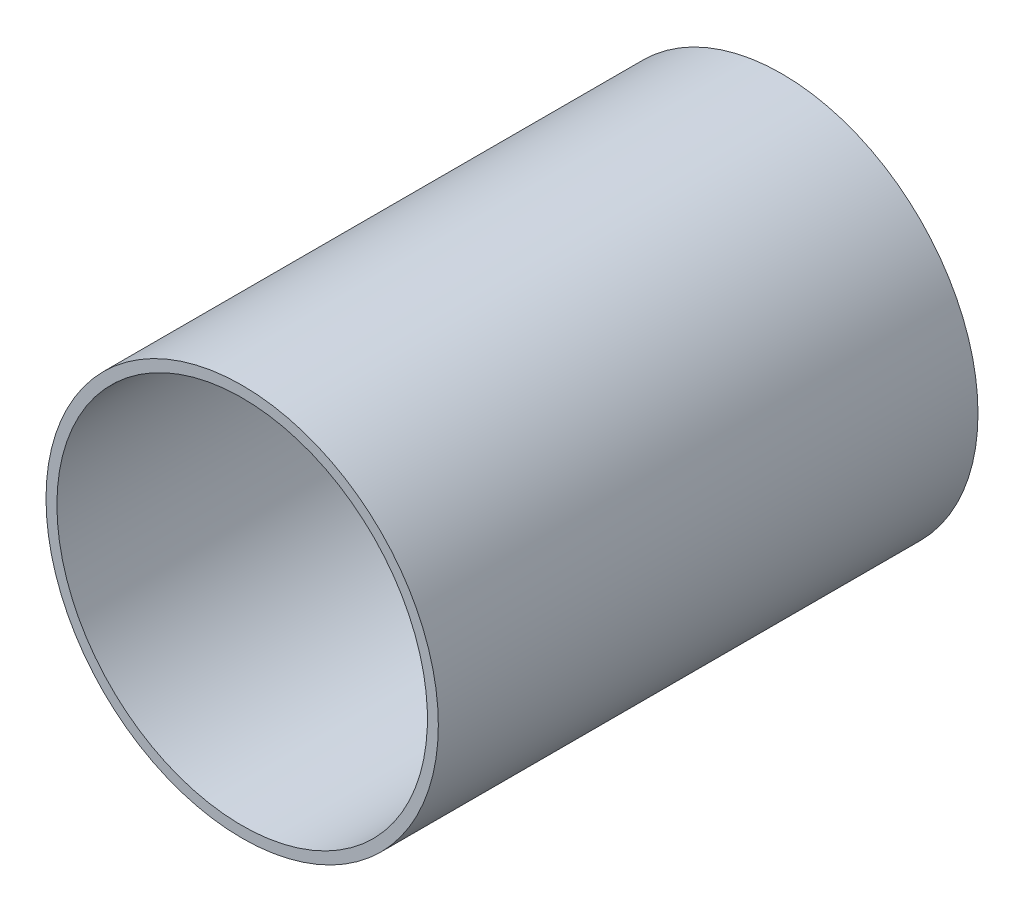
ISO-10303-21;
HEADER;
FILE_DESCRIPTION(('STEP AP214'),'2;1');
FILE_NAME('part.step','',(''),(''),'','','');
FILE_SCHEMA(('AUTOMOTIVE_DESIGN { 1 0 10303 214 1 1 1 1 }'));
ENDSEC;
DATA;
#1=APPLICATION_CONTEXT('core data for automotive mechanical design processes');
#2=APPLICATION_PROTOCOL_DEFINITION('international standard','automotive_design',2000,#1);
#3=PRODUCT_CONTEXT('',#1,'mechanical');
#4=PRODUCT('Part','Part','',(#3));
#5=PRODUCT_RELATED_PRODUCT_CATEGORY('part','',(#4));
#6=PRODUCT_DEFINITION_FORMATION('','',#4);
#7=PRODUCT_DEFINITION_CONTEXT('part definition',#1,'design');
#8=PRODUCT_DEFINITION('design','',#6,#7);
#9=PRODUCT_DEFINITION_SHAPE('','',#8);
#10=(LENGTH_UNIT() NAMED_UNIT(*) SI_UNIT(.MILLI.,.METRE.));
#11=(NAMED_UNIT(*) PLANE_ANGLE_UNIT() SI_UNIT($,.RADIAN.));
#12=(NAMED_UNIT(*) SI_UNIT($,.STERADIAN.) SOLID_ANGLE_UNIT());
#13=UNCERTAINTY_MEASURE_WITH_UNIT(LENGTH_MEASURE(1.E-05),#10,'distance_accuracy_value','');
#14=(GEOMETRIC_REPRESENTATION_CONTEXT(3) GLOBAL_UNCERTAINTY_ASSIGNED_CONTEXT((#13)) GLOBAL_UNIT_ASSIGNED_CONTEXT((#10,
#11,#12)) REPRESENTATION_CONTEXT('',''));
#15=CARTESIAN_POINT('',(0.,0.,0.));
#16=DIRECTION('',(0.,0.,1.));
#17=DIRECTION('',(1.,0.,0.));
#18=AXIS2_PLACEMENT_3D('',#15,#16,#17);
#19=CARTESIAN_POINT('',(0.,0.,152.4));
#20=DIRECTION('',(0.,0.,-1.));
#21=DIRECTION('',(-1.,0.,0.));
#22=AXIS2_PLACEMENT_3D('',#19,#20,#21);
#23=CYLINDRICAL_SURFACE('',#22,57.15);
#24=CARTESIAN_POINT('',(0.,0.,-152.4));
#25=DIRECTION('',(0.,0.,1.));
#26=DIRECTION('',(1.,0.,0.));
#27=AXIS2_PLACEMENT_3D('',#24,#25,#26);
#28=CIRCLE('',#27,57.15);
#29=CARTESIAN_POINT('',(-57.15,0.,-152.4));
#30=VERTEX_POINT('',#29);
#31=EDGE_CURVE('E10',#30,#30,#28,.T.);
#32=CARTESIAN_POINT('',(0.,0.,4.82600000000002));
#33=DIRECTION('',(0.,0.,1.));
#34=DIRECTION('',(1.,0.,0.));
#35=AXIS2_PLACEMENT_3D('',#32,#33,#34);
#36=CIRCLE('',#35,57.15);
#37=CARTESIAN_POINT('',(-57.15,0.,4.826));
#38=VERTEX_POINT('',#37);
#39=EDGE_CURVE('E55',#38,#38,#36,.T.);
#40=CARTESIAN_POINT('',(-57.15,0.,-152.4));
#41=CARTESIAN_POINT('',(-57.15,0.,-150.762229166667));
#42=CARTESIAN_POINT('',(-57.15,0.,-149.124458333333));
#43=CARTESIAN_POINT('',(-57.15,0.,-145.848916666667));
#44=CARTESIAN_POINT('',(-57.15,0.,-144.211145833333));
#45=CARTESIAN_POINT('',(-57.15,0.,-140.935604166667));
#46=CARTESIAN_POINT('',(-57.15,0.,-139.297833333333));
#47=CARTESIAN_POINT('',(-57.15,0.,-136.022291666667));
#48=CARTESIAN_POINT('',(-57.15,0.,-134.384520833333));
#49=CARTESIAN_POINT('',(-57.15,0.,-131.108979166667));
#50=CARTESIAN_POINT('',(-57.15,0.,-129.471208333333));
#51=CARTESIAN_POINT('',(-57.15,0.,-126.195666666667));
#52=CARTESIAN_POINT('',(-57.15,0.,-124.557895833333));
#53=CARTESIAN_POINT('',(-57.15,0.,-121.282354166667));
#54=CARTESIAN_POINT('',(-57.15,0.,-119.644583333333));
#55=CARTESIAN_POINT('',(-57.15,0.,-116.369041666667));
#56=CARTESIAN_POINT('',(-57.15,0.,-114.731270833333));
#57=CARTESIAN_POINT('',(-57.15,0.,-111.455729166667));
#58=CARTESIAN_POINT('',(-57.15,0.,-109.817958333333));
#59=CARTESIAN_POINT('',(-57.15,0.,-106.542416666667));
#60=CARTESIAN_POINT('',(-57.15,0.,-104.904645833333));
#61=CARTESIAN_POINT('',(-57.15,0.,-101.629104166667));
#62=CARTESIAN_POINT('',(-57.15,0.,-99.9913333333333));
#63=CARTESIAN_POINT('',(-57.15,0.,-96.7157916666667));
#64=CARTESIAN_POINT('',(-57.15,0.,-95.0780208333334));
#65=CARTESIAN_POINT('',(-57.15,0.,-91.8024791666667));
#66=CARTESIAN_POINT('',(-57.15,0.,-90.1647083333334));
#67=CARTESIAN_POINT('',(-57.15,0.,-86.8891666666667));
#68=CARTESIAN_POINT('',(-57.15,0.,-85.2513958333333));
#69=CARTESIAN_POINT('',(-57.15,0.,-81.9758541666667));
#70=CARTESIAN_POINT('',(-57.15,0.,-80.3380833333334));
#71=CARTESIAN_POINT('',(-57.15,0.,-77.0625416666667));
#72=CARTESIAN_POINT('',(-57.15,0.,-75.4247708333334));
#73=CARTESIAN_POINT('',(-57.15,0.,-72.1492291666667));
#74=CARTESIAN_POINT('',(-57.15,0.,-70.5114583333334));
#75=CARTESIAN_POINT('',(-57.15,0.,-67.2359166666667));
#76=CARTESIAN_POINT('',(-57.15,0.,-65.5981458333333));
#77=CARTESIAN_POINT('',(-57.15,0.,-62.3226041666667));
#78=CARTESIAN_POINT('',(-57.15,0.,-60.6848333333334));
#79=CARTESIAN_POINT('',(-57.15,0.,-57.4092916666667));
#80=CARTESIAN_POINT('',(-57.15,0.,-55.7715208333333));
#81=CARTESIAN_POINT('',(-57.15,0.,-52.4959791666667));
#82=CARTESIAN_POINT('',(-57.15,0.,-50.8582083333334));
#83=CARTESIAN_POINT('',(-57.15,0.,-47.5826666666667));
#84=CARTESIAN_POINT('',(-57.15,0.,-45.9448958333333));
#85=CARTESIAN_POINT('',(-57.15,0.,-42.6693541666667));
#86=CARTESIAN_POINT('',(-57.15,0.,-41.0315833333333));
#87=CARTESIAN_POINT('',(-57.15,0.,-37.7560416666667));
#88=CARTESIAN_POINT('',(-57.15,0.,-36.1182708333334));
#89=CARTESIAN_POINT('',(-57.15,0.,-32.8427291666667));
#90=CARTESIAN_POINT('',(-57.15,0.,-31.2049583333333));
#91=CARTESIAN_POINT('',(-57.15,0.,-27.9294166666667));
#92=CARTESIAN_POINT('',(-57.15,0.,-26.2916458333333));
#93=CARTESIAN_POINT('',(-57.15,0.,-23.0161041666667));
#94=CARTESIAN_POINT('',(-57.15,0.,-21.3783333333333));
#95=CARTESIAN_POINT('',(-57.15,0.,-18.1027916666667));
#96=CARTESIAN_POINT('',(-57.15,0.,-16.4650208333333));
#97=CARTESIAN_POINT('',(-57.15,0.,-13.1894791666667));
#98=CARTESIAN_POINT('',(-57.15,0.,-11.5517083333333));
#99=CARTESIAN_POINT('',(-57.15,0.,-8.27616666666667));
#100=CARTESIAN_POINT('',(-57.15,0.,-6.63839583333334));
#101=CARTESIAN_POINT('',(-57.15,0.,-3.36285416666667));
#102=CARTESIAN_POINT('',(-57.15,0.,-1.72508333333333));
#103=CARTESIAN_POINT('',(-57.15,0.,1.55045833333334));
#104=CARTESIAN_POINT('',(-57.15,0.,3.18822916666667));
#105=CARTESIAN_POINT('',(-57.15,0.,4.826));
#106=B_SPLINE_CURVE_WITH_KNOTS('',3,(#40,#41,#42,#43,#44,#45,#46,#47,#48,#49,#50,#51,#52,#53,
#54,#55,#56,#57,#58,#59,#60,#61,#62,#63,#64,#65,#66,#67,#68,#69,#70,#71,#72,#73,#74,#75,#76,#77,
#78,#79,#80,#81,#82,#83,#84,#85,#86,#87,#88,#89,#90,#91,#92,#93,#94,#95,#96,#97,#98,#99,#100,
#101,#102,#103,#104,#105),.UNSPECIFIED.,.F.,.F.,(4,2,2,2,2,2,2,2,2,2,2,2,2,2,2,2,2,2,2,2,2,2,2,
2,2,2,2,2,2,2,2,2,4),(0.,4.91331249999999,9.82662499999998,14.7399375,19.65325,24.5665625,
29.479875,34.3931875,39.3065,44.2198125,49.133125,54.0464375,58.95975,63.8730625,68.786375,
73.6996875,78.613,83.5263125,88.439625,93.3529375,98.26625,103.1795625,108.092875,113.0061875,
117.9195,122.8328125,127.746125,132.6594375,137.57275,142.4860625,147.399375,152.3126875,
157.226),.UNSPECIFIED.);
#107=EDGE_CURVE('BSEAM42',#30,#38,#106,.T.);
#108=ORIENTED_EDGE('',*,*,#31,.T.);
#109=ORIENTED_EDGE('',*,*,#39,.F.);
#110=ORIENTED_EDGE('',*,*,#107,.T.);
#111=ORIENTED_EDGE('',*,*,#107,.F.);
#112=EDGE_LOOP('',(#108,#110,#109,#111));
#113=FACE_BOUND('',#112,.T.);
#114=ADVANCED_FACE('F42',(#113),#23,.T.);
#115=CARTESIAN_POINT('',(0.,0.,152.4));
#116=DIRECTION('',(0.,0.,-1.));
#117=DIRECTION('',(-1.,0.,0.));
#118=AXIS2_PLACEMENT_3D('',#115,#116,#117);
#119=CYLINDRICAL_SURFACE('',#118,53.975);
#120=CARTESIAN_POINT('',(0.,0.,-152.4));
#121=DIRECTION('',(0.,0.,1.));
#122=DIRECTION('',(1.,0.,0.));
#123=AXIS2_PLACEMENT_3D('',#120,#121,#122);
#124=CIRCLE('',#123,53.975);
#125=CARTESIAN_POINT('',(-53.975,0.,-152.4));
#126=VERTEX_POINT('',#125);
#127=EDGE_CURVE('E50',#126,#126,#124,.T.);
#128=CARTESIAN_POINT('',(0.,0.,4.82600000000002));
#129=DIRECTION('',(0.,0.,1.));
#130=DIRECTION('',(1.,0.,0.));
#131=AXIS2_PLACEMENT_3D('',#128,#129,#130);
#132=CIRCLE('',#131,53.975);
#133=CARTESIAN_POINT('',(-53.975,0.,4.826));
#134=VERTEX_POINT('',#133);
#135=EDGE_CURVE('E45',#134,#134,#132,.T.);
#136=CARTESIAN_POINT('',(-53.975,0.,-152.4));
#137=CARTESIAN_POINT('',(-53.975,0.,-150.762229166667));
#138=CARTESIAN_POINT('',(-53.975,0.,-149.124458333333));
#139=CARTESIAN_POINT('',(-53.975,0.,-145.848916666667));
#140=CARTESIAN_POINT('',(-53.975,0.,-144.211145833333));
#141=CARTESIAN_POINT('',(-53.975,0.,-140.935604166667));
#142=CARTESIAN_POINT('',(-53.975,0.,-139.297833333333));
#143=CARTESIAN_POINT('',(-53.975,0.,-136.022291666667));
#144=CARTESIAN_POINT('',(-53.975,0.,-134.384520833333));
#145=CARTESIAN_POINT('',(-53.975,0.,-131.108979166667));
#146=CARTESIAN_POINT('',(-53.975,0.,-129.471208333333));
#147=CARTESIAN_POINT('',(-53.975,0.,-126.195666666667));
#148=CARTESIAN_POINT('',(-53.975,0.,-124.557895833333));
#149=CARTESIAN_POINT('',(-53.975,0.,-121.282354166667));
#150=CARTESIAN_POINT('',(-53.975,0.,-119.644583333333));
#151=CARTESIAN_POINT('',(-53.975,0.,-116.369041666667));
#152=CARTESIAN_POINT('',(-53.975,0.,-114.731270833333));
#153=CARTESIAN_POINT('',(-53.975,0.,-111.455729166667));
#154=CARTESIAN_POINT('',(-53.975,0.,-109.817958333333));
#155=CARTESIAN_POINT('',(-53.975,0.,-106.542416666667));
#156=CARTESIAN_POINT('',(-53.975,0.,-104.904645833333));
#157=CARTESIAN_POINT('',(-53.975,0.,-101.629104166667));
#158=CARTESIAN_POINT('',(-53.975,0.,-99.9913333333333));
#159=CARTESIAN_POINT('',(-53.975,0.,-96.7157916666667));
#160=CARTESIAN_POINT('',(-53.975,0.,-95.0780208333334));
#161=CARTESIAN_POINT('',(-53.975,0.,-91.8024791666667));
#162=CARTESIAN_POINT('',(-53.975,0.,-90.1647083333334));
#163=CARTESIAN_POINT('',(-53.975,0.,-86.8891666666667));
#164=CARTESIAN_POINT('',(-53.975,0.,-85.2513958333333));
#165=CARTESIAN_POINT('',(-53.975,0.,-81.9758541666667));
#166=CARTESIAN_POINT('',(-53.975,0.,-80.3380833333334));
#167=CARTESIAN_POINT('',(-53.975,0.,-77.0625416666667));
#168=CARTESIAN_POINT('',(-53.975,0.,-75.4247708333334));
#169=CARTESIAN_POINT('',(-53.975,0.,-72.1492291666667));
#170=CARTESIAN_POINT('',(-53.975,0.,-70.5114583333334));
#171=CARTESIAN_POINT('',(-53.975,0.,-67.2359166666667));
#172=CARTESIAN_POINT('',(-53.975,0.,-65.5981458333333));
#173=CARTESIAN_POINT('',(-53.975,0.,-62.3226041666667));
#174=CARTESIAN_POINT('',(-53.975,0.,-60.6848333333334));
#175=CARTESIAN_POINT('',(-53.975,0.,-57.4092916666667));
#176=CARTESIAN_POINT('',(-53.975,0.,-55.7715208333333));
#177=CARTESIAN_POINT('',(-53.975,0.,-52.4959791666667));
#178=CARTESIAN_POINT('',(-53.975,0.,-50.8582083333334));
#179=CARTESIAN_POINT('',(-53.975,0.,-47.5826666666667));
#180=CARTESIAN_POINT('',(-53.975,0.,-45.9448958333333));
#181=CARTESIAN_POINT('',(-53.975,0.,-42.6693541666667));
#182=CARTESIAN_POINT('',(-53.975,0.,-41.0315833333333));
#183=CARTESIAN_POINT('',(-53.975,0.,-37.7560416666667));
#184=CARTESIAN_POINT('',(-53.975,0.,-36.1182708333334));
#185=CARTESIAN_POINT('',(-53.975,0.,-32.8427291666667));
#186=CARTESIAN_POINT('',(-53.975,0.,-31.2049583333333));
#187=CARTESIAN_POINT('',(-53.975,0.,-27.9294166666667));
#188=CARTESIAN_POINT('',(-53.975,0.,-26.2916458333333));
#189=CARTESIAN_POINT('',(-53.975,0.,-23.0161041666667));
#190=CARTESIAN_POINT('',(-53.975,0.,-21.3783333333333));
#191=CARTESIAN_POINT('',(-53.975,0.,-18.1027916666667));
#192=CARTESIAN_POINT('',(-53.975,0.,-16.4650208333333));
#193=CARTESIAN_POINT('',(-53.975,0.,-13.1894791666667));
#194=CARTESIAN_POINT('',(-53.975,0.,-11.5517083333333));
#195=CARTESIAN_POINT('',(-53.975,0.,-8.27616666666667));
#196=CARTESIAN_POINT('',(-53.975,0.,-6.63839583333334));
#197=CARTESIAN_POINT('',(-53.975,0.,-3.36285416666667));
#198=CARTESIAN_POINT('',(-53.975,0.,-1.72508333333333));
#199=CARTESIAN_POINT('',(-53.975,0.,1.55045833333334));
#200=CARTESIAN_POINT('',(-53.975,0.,3.18822916666667));
#201=CARTESIAN_POINT('',(-53.975,0.,4.826));
#202=B_SPLINE_CURVE_WITH_KNOTS('',3,(#136,#137,#138,#139,#140,#141,#142,#143,#144,#145,#146,
#147,#148,#149,#150,#151,#152,#153,#154,#155,#156,#157,#158,#159,#160,#161,#162,#163,#164,#165,
#166,#167,#168,#169,#170,#171,#172,#173,#174,#175,#176,#177,#178,#179,#180,#181,#182,#183,#184,
#185,#186,#187,#188,#189,#190,#191,#192,#193,#194,#195,#196,#197,#198,#199,#200,#201),
.UNSPECIFIED.,.F.,.F.,(4,2,2,2,2,2,2,2,2,2,2,2,2,2,2,2,2,2,2,2,2,2,2,2,2,2,2,2,2,2,2,2,4),(0.,
4.91331249999999,9.82662499999998,14.7399375,19.65325,24.5665625,29.479875,34.3931875,39.3065,
44.2198125,49.133125,54.0464375,58.95975,63.8730625,68.786375,73.6996875,78.613,83.5263125,
88.439625,93.3529375,98.26625,103.1795625,108.092875,113.0061875,117.9195,122.8328125,
127.746125,132.6594375,137.57275,142.4860625,147.399375,152.3126875,157.226),.UNSPECIFIED.);
#203=EDGE_CURVE('BSEAM66',#126,#134,#202,.T.);
#204=ORIENTED_EDGE('',*,*,#127,.F.);
#205=ORIENTED_EDGE('',*,*,#135,.T.);
#206=ORIENTED_EDGE('',*,*,#203,.T.);
#207=ORIENTED_EDGE('',*,*,#203,.F.);
#208=EDGE_LOOP('',(#204,#206,#205,#207));
#209=FACE_BOUND('',#208,.T.);
#210=ADVANCED_FACE('F66',(#209),#119,.F.);
#211=CARTESIAN_POINT('',(0.,0.,-152.4));
#212=DIRECTION('',(0.,0.,1.));
#213=DIRECTION('',(1.,0.,0.));
#214=AXIS2_PLACEMENT_3D('',#211,#212,#213);
#215=PLANE('',#214);
#216=ORIENTED_EDGE('',*,*,#127,.T.);
#217=EDGE_LOOP('',(#216));
#218=FACE_BOUND('',#217,.T.);
#219=ORIENTED_EDGE('',*,*,#31,.F.);
#220=EDGE_LOOP('',(#219));
#221=FACE_BOUND('',#220,.T.);
#222=ADVANCED_FACE('F70',(#218,#221),#215,.F.);
#223=CARTESIAN_POINT('',(0.,0.,4.82600000000002));
#224=DIRECTION('',(0.,0.,1.));
#225=DIRECTION('',(1.,0.,0.));
#226=AXIS2_PLACEMENT_3D('',#223,#224,#225);
#227=PLANE('',#226);
#228=ORIENTED_EDGE('',*,*,#135,.F.);
#229=EDGE_LOOP('',(#228));
#230=FACE_BOUND('',#229,.T.);
#231=ORIENTED_EDGE('',*,*,#39,.T.);
#232=EDGE_LOOP('',(#231));
#233=FACE_BOUND('',#232,.T.);
#234=ADVANCED_FACE('F68',(#230,#233),#227,.T.);
#235=CLOSED_SHELL('',(#114,#210,#222,#234));
#236=MANIFOLD_SOLID_BREP('B2',#235);
#237=ADVANCED_BREP_SHAPE_REPRESENTATION('',(#18,#236),#14);
#238=SHAPE_DEFINITION_REPRESENTATION(#9,#237);
ENDSEC;
END-ISO-10303-21;
